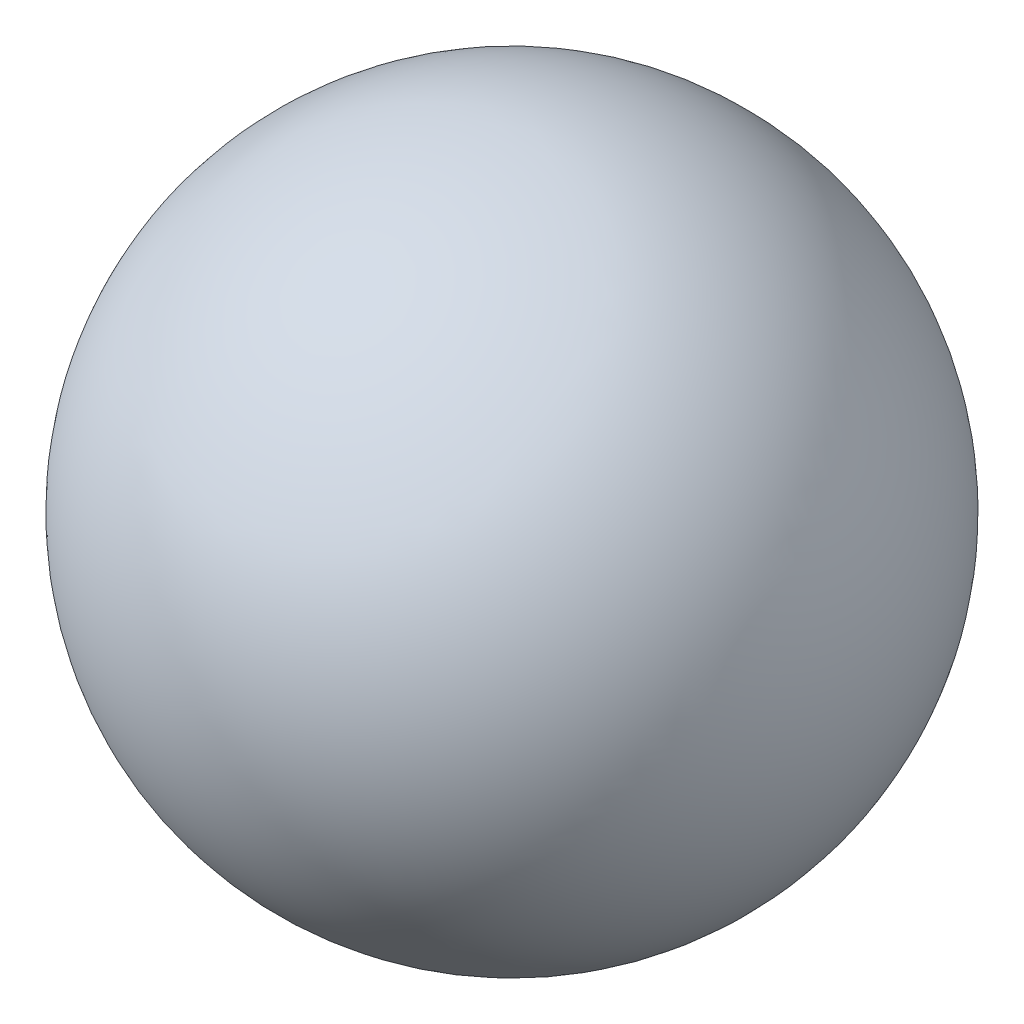
ISO-10303-21;
HEADER;
FILE_DESCRIPTION(('STEP AP214'),'2;1');
FILE_NAME('part.step','',(''),(''),'','','');
FILE_SCHEMA(('AUTOMOTIVE_DESIGN { 1 0 10303 214 1 1 1 1 }'));
ENDSEC;
DATA;
#1=APPLICATION_CONTEXT('core data for automotive mechanical design processes');
#2=APPLICATION_PROTOCOL_DEFINITION('international standard','automotive_design',2000,#1);
#3=PRODUCT_CONTEXT('',#1,'mechanical');
#4=PRODUCT('Part','Part','',(#3));
#5=PRODUCT_RELATED_PRODUCT_CATEGORY('part','',(#4));
#6=PRODUCT_DEFINITION_FORMATION('','',#4);
#7=PRODUCT_DEFINITION_CONTEXT('part definition',#1,'design');
#8=PRODUCT_DEFINITION('design','',#6,#7);
#9=PRODUCT_DEFINITION_SHAPE('','',#8);
#10=(LENGTH_UNIT() NAMED_UNIT(*) SI_UNIT(.MILLI.,.METRE.));
#11=(NAMED_UNIT(*) PLANE_ANGLE_UNIT() SI_UNIT($,.RADIAN.));
#12=(NAMED_UNIT(*) SI_UNIT($,.STERADIAN.) SOLID_ANGLE_UNIT());
#13=UNCERTAINTY_MEASURE_WITH_UNIT(LENGTH_MEASURE(1.E-05),#10,'distance_accuracy_value','');
#14=(GEOMETRIC_REPRESENTATION_CONTEXT(3) GLOBAL_UNCERTAINTY_ASSIGNED_CONTEXT((#13)) GLOBAL_UNIT_ASSIGNED_CONTEXT((#10,
#11,#12)) REPRESENTATION_CONTEXT('',''));
#15=CARTESIAN_POINT('',(0.,0.,0.));
#16=DIRECTION('',(0.,0.,1.));
#17=DIRECTION('',(1.,0.,0.));
#18=AXIS2_PLACEMENT_3D('',#15,#16,#17);
#19=CARTESIAN_POINT('',(2.,2.97,0.));
#20=DIRECTION('',(-1.,0.,0.));
#21=DIRECTION('',(0.,-1.,0.));
#22=AXIS2_PLACEMENT_3D('',#19,#20,#21);
#23=SPHERICAL_SURFACE('',#22,0.794);
#24=CARTESIAN_POINT('',(1.206,2.97,0.));
#25=VERTEX_POINT('',#24);
#26=VERTEX_LOOP('',#25);
#27=FACE_BOUND('',#26,.T.);
#28=ADVANCED_FACE('F37',(#27),#23,.T.);
#29=CLOSED_SHELL('',(#28));
#30=MANIFOLD_SOLID_BREP('B2',#29);
#31=ADVANCED_BREP_SHAPE_REPRESENTATION('',(#18,#30),#14);
#32=SHAPE_DEFINITION_REPRESENTATION(#9,#31);
ENDSEC;
END-ISO-10303-21;
